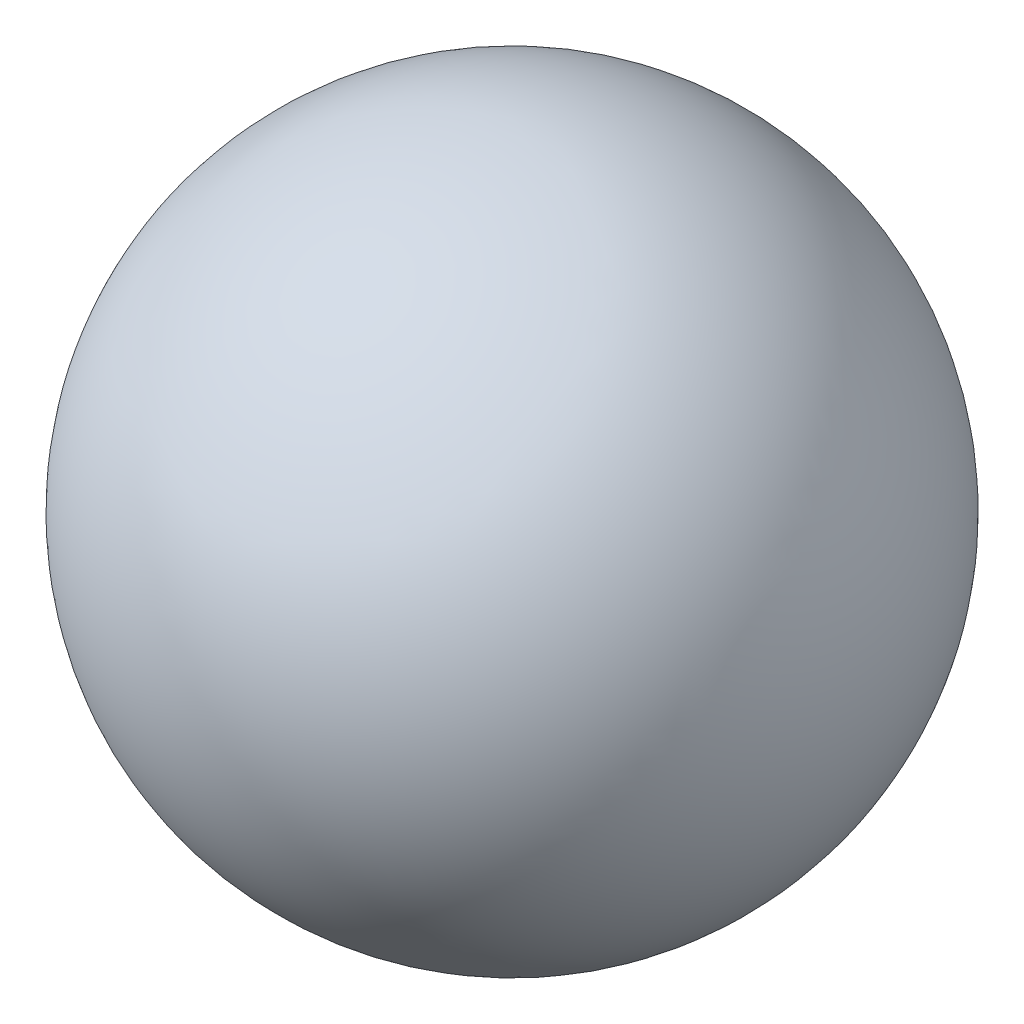
ISO-10303-21;
HEADER;
FILE_DESCRIPTION(('STEP AP214'),'2;1');
FILE_NAME('part.step','',(''),(''),'','','');
FILE_SCHEMA(('AUTOMOTIVE_DESIGN { 1 0 10303 214 1 1 1 1 }'));
ENDSEC;
DATA;
#1=APPLICATION_CONTEXT('core data for automotive mechanical design processes');
#2=APPLICATION_PROTOCOL_DEFINITION('international standard','automotive_design',2000,#1);
#3=PRODUCT_CONTEXT('',#1,'mechanical');
#4=PRODUCT('Part','Part','',(#3));
#5=PRODUCT_RELATED_PRODUCT_CATEGORY('part','',(#4));
#6=PRODUCT_DEFINITION_FORMATION('','',#4);
#7=PRODUCT_DEFINITION_CONTEXT('part definition',#1,'design');
#8=PRODUCT_DEFINITION('design','',#6,#7);
#9=PRODUCT_DEFINITION_SHAPE('','',#8);
#10=(LENGTH_UNIT() NAMED_UNIT(*) SI_UNIT(.MILLI.,.METRE.));
#11=(NAMED_UNIT(*) PLANE_ANGLE_UNIT() SI_UNIT($,.RADIAN.));
#12=(NAMED_UNIT(*) SI_UNIT($,.STERADIAN.) SOLID_ANGLE_UNIT());
#13=UNCERTAINTY_MEASURE_WITH_UNIT(LENGTH_MEASURE(1.E-05),#10,'distance_accuracy_value','');
#14=(GEOMETRIC_REPRESENTATION_CONTEXT(3) GLOBAL_UNCERTAINTY_ASSIGNED_CONTEXT((#13)) GLOBAL_UNIT_ASSIGNED_CONTEXT((#10,
#11,#12)) REPRESENTATION_CONTEXT('',''));
#15=CARTESIAN_POINT('',(0.,0.,0.));
#16=DIRECTION('',(0.,0.,1.));
#17=DIRECTION('',(1.,0.,0.));
#18=AXIS2_PLACEMENT_3D('',#15,#16,#17);
#19=CARTESIAN_POINT('',(0.,0.,0.));
#20=DIRECTION('',(1.,0.,0.));
#21=DIRECTION('',(0.,-1.,0.));
#22=AXIS2_PLACEMENT_3D('',#19,#20,#21);
#23=SPHERICAL_SURFACE('',#22,2.2);
#24=CARTESIAN_POINT('',(2.2,0.,0.));
#25=VERTEX_POINT('',#24);
#26=VERTEX_LOOP('',#25);
#27=FACE_BOUND('',#26,.T.);
#28=ADVANCED_FACE('F32',(#27),#23,.T.);
#29=CLOSED_SHELL('',(#28));
#30=MANIFOLD_SOLID_BREP('B2',#29);
#31=ADVANCED_BREP_SHAPE_REPRESENTATION('',(#18,#30),#14);
#32=SHAPE_DEFINITION_REPRESENTATION(#9,#31);
ENDSEC;
END-ISO-10303-21;
